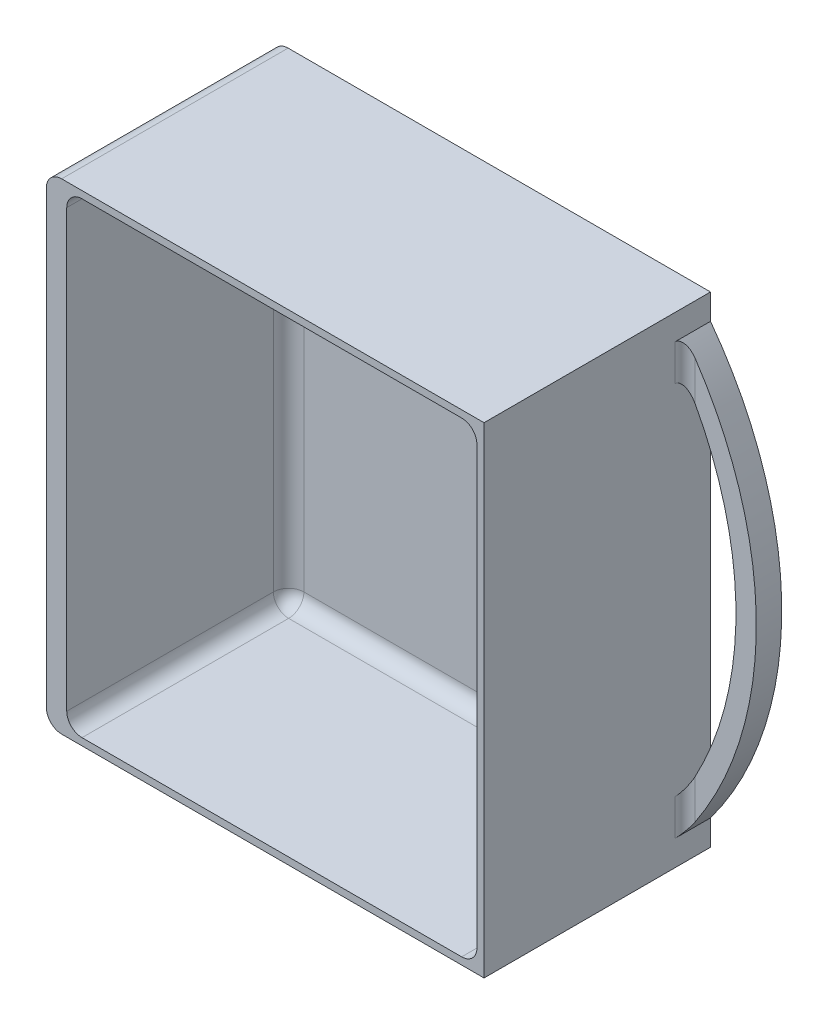
ISO-10303-21;
HEADER;
FILE_DESCRIPTION(('STEP AP214'),'2;1');
FILE_NAME('part.step','',(''),(''),'','','');
FILE_SCHEMA(('AUTOMOTIVE_DESIGN { 1 0 10303 214 1 1 1 1 }'));
ENDSEC;
DATA;
#1=APPLICATION_CONTEXT('core data for automotive mechanical design processes');
#2=APPLICATION_PROTOCOL_DEFINITION('international standard','automotive_design',2000,#1);
#3=PRODUCT_CONTEXT('',#1,'mechanical');
#4=PRODUCT('Part','Part','',(#3));
#5=PRODUCT_RELATED_PRODUCT_CATEGORY('part','',(#4));
#6=PRODUCT_DEFINITION_FORMATION('','',#4);
#7=PRODUCT_DEFINITION_CONTEXT('part definition',#1,'design');
#8=PRODUCT_DEFINITION('design','',#6,#7);
#9=PRODUCT_DEFINITION_SHAPE('','',#8);
#10=(LENGTH_UNIT() NAMED_UNIT(*) SI_UNIT(.MILLI.,.METRE.));
#11=(NAMED_UNIT(*) PLANE_ANGLE_UNIT() SI_UNIT($,.RADIAN.));
#12=(NAMED_UNIT(*) SI_UNIT($,.STERADIAN.) SOLID_ANGLE_UNIT());
#13=UNCERTAINTY_MEASURE_WITH_UNIT(LENGTH_MEASURE(1.E-05),#10,'distance_accuracy_value','');
#14=(GEOMETRIC_REPRESENTATION_CONTEXT(3) GLOBAL_UNCERTAINTY_ASSIGNED_CONTEXT((#13)) GLOBAL_UNIT_ASSIGNED_CONTEXT((#10,
#11,#12)) REPRESENTATION_CONTEXT('',''));
#15=CARTESIAN_POINT('',(0.,0.,0.));
#16=DIRECTION('',(0.,0.,1.));
#17=DIRECTION('',(1.,0.,0.));
#18=AXIS2_PLACEMENT_3D('',#15,#16,#17);
#19=CARTESIAN_POINT('',(85.6,42.85,-18.35));
#20=DIRECTION('',(1.,0.,0.));
#21=DIRECTION('',(0.,0.,-1.));
#22=AXIS2_PLACEMENT_3D('',#19,#20,#21);
#23=SPHERICAL_SURFACE('',#22,3.);
#24=CARTESIAN_POINT('',(85.6,42.85,-18.35));
#25=DIRECTION('',(0.,0.,-1.));
#26=DIRECTION('',(-1.,0.,0.));
#27=AXIS2_PLACEMENT_3D('',#24,#25,#26);
#28=CIRCLE('',#27,3.);
#29=CARTESIAN_POINT('',(85.6,45.85,-18.35));
#30=VERTEX_POINT('',#29);
#31=CARTESIAN_POINT('',(88.6,42.85,-18.35));
#32=VERTEX_POINT('',#31);
#33=EDGE_CURVE('E350',#30,#32,#28,.T.);
#34=ORIENTED_EDGE('',*,*,#33,.F.);
#35=CARTESIAN_POINT('',(85.6,42.85,-18.35));
#36=DIRECTION('',(1.,0.,0.));
#37=DIRECTION('',(0.,0.,-1.));
#38=AXIS2_PLACEMENT_3D('',#35,#36,#37);
#39=CIRCLE('',#38,3.);
#40=CARTESIAN_POINT('',(85.6,42.85,-21.35));
#41=VERTEX_POINT('',#40);
#42=EDGE_CURVE('E334',#41,#30,#39,.T.);
#43=ORIENTED_EDGE('',*,*,#42,.F.);
#44=CARTESIAN_POINT('',(85.6,42.85,-18.35));
#45=DIRECTION('',(0.,-1.,0.));
#46=DIRECTION('',(0.,0.,-1.));
#47=AXIS2_PLACEMENT_3D('',#44,#45,#46);
#48=CIRCLE('',#47,3.);
#49=EDGE_CURVE('E347',#41,#32,#48,.T.);
#50=ORIENTED_EDGE('',*,*,#49,.T.);
#51=EDGE_LOOP('',(#34,#43,#50));
#52=FACE_BOUND('',#51,.T.);
#53=ADVANCED_FACE('F33',(#52),#23,.F.);
#54=CARTESIAN_POINT('',(85.6,0.,-18.35));
#55=DIRECTION('',(0.,1.,0.));
#56=DIRECTION('',(0.,0.,1.));
#57=AXIS2_PLACEMENT_3D('',#54,#55,#56);
#58=CYLINDRICAL_SURFACE('',#57,3.);
#59=ORIENTED_EDGE('',*,*,#49,.F.);
#60=DIRECTION('',(0.,1.,0.));
#61=VECTOR('',#60,1.);
#62=CARTESIAN_POINT('',(85.6,0.,-21.35));
#63=LINE('',#62,#61);
#64=CARTESIAN_POINT('',(85.6,-42.85,-21.35));
#65=VERTEX_POINT('',#64);
#66=EDGE_CURVE('E331',#65,#41,#63,.T.);
#67=ORIENTED_EDGE('',*,*,#66,.F.);
#68=CARTESIAN_POINT('',(85.6,-42.85,-18.35));
#69=DIRECTION('',(0.,-1.,0.));
#70=DIRECTION('',(0.,0.,-1.));
#71=AXIS2_PLACEMENT_3D('',#68,#69,#70);
#72=CIRCLE('',#71,3.);
#73=CARTESIAN_POINT('',(88.6,-42.85,-18.35));
#74=VERTEX_POINT('',#73);
#75=EDGE_CURVE('E345',#65,#74,#72,.T.);
#76=ORIENTED_EDGE('',*,*,#75,.T.);
#77=DIRECTION('',(0.,1.,0.));
#78=VECTOR('',#77,1.);
#79=CARTESIAN_POINT('',(88.6,-45.85,-18.35));
#80=LINE('',#79,#78);
#81=EDGE_CURVE('E322',#32,#74,#80,.F.);
#82=ORIENTED_EDGE('',*,*,#81,.F.);
#83=EDGE_LOOP('',(#59,#67,#76,#82));
#84=FACE_BOUND('',#83,.T.);
#85=ADVANCED_FACE('F389',(#84),#58,.F.);
#86=CARTESIAN_POINT('',(85.6,-42.85,-18.35));
#87=DIRECTION('',(1.,0.,0.));
#88=DIRECTION('',(0.,0.,-1.));
#89=AXIS2_PLACEMENT_3D('',#86,#87,#88);
#90=SPHERICAL_SURFACE('',#89,3.);
#91=ORIENTED_EDGE('',*,*,#75,.F.);
#92=CARTESIAN_POINT('',(85.6,-42.85,-18.35));
#93=DIRECTION('',(-1.,0.,0.));
#94=DIRECTION('',(0.,0.,1.));
#95=AXIS2_PLACEMENT_3D('',#92,#93,#94);
#96=CIRCLE('',#95,3.);
#97=CARTESIAN_POINT('',(85.6,-45.85,-18.35));
#98=VERTEX_POINT('',#97);
#99=EDGE_CURVE('E328',#98,#65,#96,.F.);
#100=ORIENTED_EDGE('',*,*,#99,.F.);
#101=CARTESIAN_POINT('',(85.6,-42.85,-18.35));
#102=DIRECTION('',(0.,0.,1.));
#103=DIRECTION('',(1.,0.,0.));
#104=AXIS2_PLACEMENT_3D('',#101,#102,#103);
#105=CIRCLE('',#104,3.);
#106=EDGE_CURVE('E342',#98,#74,#105,.T.);
#107=ORIENTED_EDGE('',*,*,#106,.T.);
#108=EDGE_LOOP('',(#91,#100,#107));
#109=FACE_BOUND('',#108,.T.);
#110=ADVANCED_FACE('F393',(#109),#90,.F.);
#111=CARTESIAN_POINT('',(85.6,-42.85,-21.35));
#112=DIRECTION('',(0.,0.,1.));
#113=DIRECTION('',(1.,0.,0.));
#114=AXIS2_PLACEMENT_3D('',#111,#112,#113);
#115=CYLINDRICAL_SURFACE('',#114,3.);
#116=ORIENTED_EDGE('',*,*,#106,.F.);
#117=DIRECTION('',(0.,0.,-1.));
#118=VECTOR('',#117,1.);
#119=CARTESIAN_POINT('',(85.6,-45.85,-21.35));
#120=LINE('',#119,#118);
#121=CARTESIAN_POINT('',(85.6,-45.85,22.25));
#122=VERTEX_POINT('',#121);
#123=EDGE_CURVE('E316',#122,#98,#120,.T.);
#124=ORIENTED_EDGE('',*,*,#123,.F.);
#125=CARTESIAN_POINT('',(85.6,-42.85,22.25));
#126=DIRECTION('',(0.,0.,1.));
#127=DIRECTION('',(1.,0.,0.));
#128=AXIS2_PLACEMENT_3D('',#125,#126,#127);
#129=CIRCLE('',#128,3.);
#130=CARTESIAN_POINT('',(88.6,-42.85,22.25));
#131=VERTEX_POINT('',#130);
#132=EDGE_CURVE('E340',#122,#131,#129,.T.);
#133=ORIENTED_EDGE('',*,*,#132,.T.);
#134=DIRECTION('',(0.,0.,-1.));
#135=VECTOR('',#134,1.);
#136=CARTESIAN_POINT('',(88.6,-42.85,-21.35));
#137=LINE('',#136,#135);
#138=EDGE_CURVE('E325',#74,#131,#137,.F.);
#139=ORIENTED_EDGE('',*,*,#138,.F.);
#140=EDGE_LOOP('',(#116,#124,#133,#139));
#141=FACE_BOUND('',#140,.T.);
#142=ADVANCED_FACE('F385',(#141),#115,.F.);
#143=CARTESIAN_POINT('',(85.6,42.85,-21.35));
#144=DIRECTION('',(0.,0.,-1.));
#145=DIRECTION('',(-1.,0.,0.));
#146=AXIS2_PLACEMENT_3D('',#143,#144,#145);
#147=CYLINDRICAL_SURFACE('',#146,3.);
#148=DIRECTION('',(0.,0.,1.));
#149=VECTOR('',#148,1.);
#150=CARTESIAN_POINT('',(85.6,45.85,-21.35));
#151=LINE('',#150,#149);
#152=CARTESIAN_POINT('',(85.6,45.85,22.25));
#153=VERTEX_POINT('',#152);
#154=EDGE_CURVE('E337',#30,#153,#151,.T.);
#155=ORIENTED_EDGE('',*,*,#154,.F.);
#156=ORIENTED_EDGE('',*,*,#33,.T.);
#157=DIRECTION('',(0.,0.,1.));
#158=VECTOR('',#157,1.);
#159=CARTESIAN_POINT('',(88.6,42.85,-21.35));
#160=LINE('',#159,#158);
#161=CARTESIAN_POINT('',(88.6,42.85,22.25));
#162=VERTEX_POINT('',#161);
#163=EDGE_CURVE('E319',#162,#32,#160,.F.);
#164=ORIENTED_EDGE('',*,*,#163,.F.);
#165=CARTESIAN_POINT('',(85.6,42.85,22.25));
#166=DIRECTION('',(0.,0.,1.));
#167=DIRECTION('',(1.,0.,0.));
#168=AXIS2_PLACEMENT_3D('',#165,#166,#167);
#169=CIRCLE('',#168,3.);
#170=EDGE_CURVE('E352',#162,#153,#169,.T.);
#171=ORIENTED_EDGE('',*,*,#170,.T.);
#172=EDGE_LOOP('',(#155,#156,#164,#171));
#173=FACE_BOUND('',#172,.T.);
#174=ADVANCED_FACE('F380',(#173),#147,.F.);
#175=CARTESIAN_POINT('',(11.,42.85,-18.35));
#176=DIRECTION('',(0.,1.,0.));
#177=DIRECTION('',(0.,0.,1.));
#178=AXIS2_PLACEMENT_3D('',#175,#176,#177);
#179=SPHERICAL_SURFACE('',#178,3.);
#180=CARTESIAN_POINT('',(11.,42.85,-18.35));
#181=DIRECTION('',(-1.,0.,0.));
#182=DIRECTION('',(0.,0.,1.));
#183=AXIS2_PLACEMENT_3D('',#180,#181,#182);
#184=CIRCLE('',#183,3.);
#185=CARTESIAN_POINT('',(11.,45.85,-18.35));
#186=VERTEX_POINT('',#185);
#187=CARTESIAN_POINT('',(11.,42.85,-21.35));
#188=VERTEX_POINT('',#187);
#189=EDGE_CURVE('E313',#186,#188,#184,.T.);
#190=ORIENTED_EDGE('',*,*,#189,.F.);
#191=CARTESIAN_POINT('',(11.,42.85,-18.35));
#192=DIRECTION('',(0.,0.,1.));
#193=DIRECTION('',(1.,0.,0.));
#194=AXIS2_PLACEMENT_3D('',#191,#192,#193);
#195=CIRCLE('',#194,3.);
#196=CARTESIAN_POINT('',(8.00000000000001,42.85,-18.35));
#197=VERTEX_POINT('',#196);
#198=EDGE_CURVE('E311',#186,#197,#195,.T.);
#199=ORIENTED_EDGE('',*,*,#198,.T.);
#200=CARTESIAN_POINT('',(11.,42.85,-18.35));
#201=DIRECTION('',(0.,1.,0.));
#202=DIRECTION('',(-1.,0.,0.));
#203=AXIS2_PLACEMENT_3D('',#200,#201,#202);
#204=CIRCLE('',#203,3.);
#205=EDGE_CURVE('E304',#188,#197,#204,.T.);
#206=ORIENTED_EDGE('',*,*,#205,.F.);
#207=EDGE_LOOP('',(#190,#199,#206));
#208=FACE_BOUND('',#207,.T.);
#209=ADVANCED_FACE('F384',(#208),#179,.F.);
#210=CARTESIAN_POINT('',(11.,42.85,-21.35));
#211=DIRECTION('',(0.,0.,1.));
#212=DIRECTION('',(1.,0.,0.));
#213=AXIS2_PLACEMENT_3D('',#210,#211,#212);
#214=CYLINDRICAL_SURFACE('',#213,3.);
#215=ORIENTED_EDGE('',*,*,#198,.F.);
#216=DIRECTION('',(0.,0.,-1.));
#217=VECTOR('',#216,1.);
#218=CARTESIAN_POINT('',(11.,45.85,-21.35));
#219=LINE('',#218,#217);
#220=CARTESIAN_POINT('',(11.,45.85,22.25));
#221=VERTEX_POINT('',#220);
#222=EDGE_CURVE('E298',#221,#186,#219,.T.);
#223=ORIENTED_EDGE('',*,*,#222,.F.);
#224=CARTESIAN_POINT('',(11.,42.85,22.25));
#225=DIRECTION('',(0.,0.,1.));
#226=DIRECTION('',(1.,0.,0.));
#227=AXIS2_PLACEMENT_3D('',#224,#225,#226);
#228=CIRCLE('',#227,3.);
#229=CARTESIAN_POINT('',(8.00000000000001,42.85,22.25));
#230=VERTEX_POINT('',#229);
#231=EDGE_CURVE('E309',#221,#230,#228,.T.);
#232=ORIENTED_EDGE('',*,*,#231,.T.);
#233=DIRECTION('',(0.,0.,-1.));
#234=VECTOR('',#233,1.);
#235=CARTESIAN_POINT('',(8.00000000000001,42.85,-21.35));
#236=LINE('',#235,#234);
#237=EDGE_CURVE('E301',#197,#230,#236,.F.);
#238=ORIENTED_EDGE('',*,*,#237,.F.);
#239=EDGE_LOOP('',(#215,#223,#232,#238));
#240=FACE_BOUND('',#239,.T.);
#241=ADVANCED_FACE('F405',(#240),#214,.F.);
#242=CARTESIAN_POINT('',(88.6,42.85,-18.35));
#243=DIRECTION('',(1.,0.,0.));
#244=DIRECTION('',(0.,0.,-1.));
#245=AXIS2_PLACEMENT_3D('',#242,#243,#244);
#246=CYLINDRICAL_SURFACE('',#245,3.);
#247=DIRECTION('',(1.,0.,0.));
#248=VECTOR('',#247,1.);
#249=CARTESIAN_POINT('',(0.,42.85,-21.35));
#250=LINE('',#249,#248);
#251=EDGE_CURVE('E307',#41,#188,#250,.F.);
#252=ORIENTED_EDGE('',*,*,#251,.F.);
#253=ORIENTED_EDGE('',*,*,#42,.T.);
#254=DIRECTION('',(1.,0.,0.));
#255=VECTOR('',#254,1.);
#256=CARTESIAN_POINT('',(88.6,45.85,-18.35));
#257=LINE('',#256,#255);
#258=EDGE_CURVE('E295',#186,#30,#257,.T.);
#259=ORIENTED_EDGE('',*,*,#258,.F.);
#260=ORIENTED_EDGE('',*,*,#189,.T.);
#261=EDGE_LOOP('',(#252,#253,#259,#260));
#262=FACE_BOUND('',#261,.T.);
#263=ADVANCED_FACE('F401',(#262),#246,.F.);
#264=CARTESIAN_POINT('',(11.,-42.85,-18.35));
#265=DIRECTION('',(0.,-1.,0.));
#266=DIRECTION('',(0.,0.,-1.));
#267=AXIS2_PLACEMENT_3D('',#264,#265,#266);
#268=SPHERICAL_SURFACE('',#267,3.);
#269=CARTESIAN_POINT('',(11.,-42.85,-18.35));
#270=DIRECTION('',(0.,0.,-1.));
#271=DIRECTION('',(-1.,0.,0.));
#272=AXIS2_PLACEMENT_3D('',#269,#270,#271);
#273=CIRCLE('',#272,3.);
#274=CARTESIAN_POINT('',(11.,-45.85,-18.35));
#275=VERTEX_POINT('',#274);
#276=CARTESIAN_POINT('',(8.,-42.85,-18.35));
#277=VERTEX_POINT('',#276);
#278=EDGE_CURVE('E291',#275,#277,#273,.T.);
#279=ORIENTED_EDGE('',*,*,#278,.F.);
#280=CARTESIAN_POINT('',(11.,-42.85,-18.35));
#281=DIRECTION('',(1.,0.,0.));
#282=DIRECTION('',(0.,0.,-1.));
#283=AXIS2_PLACEMENT_3D('',#280,#281,#282);
#284=CIRCLE('',#283,3.);
#285=CARTESIAN_POINT('',(11.,-42.85,-21.35));
#286=VERTEX_POINT('',#285);
#287=EDGE_CURVE('E288',#275,#286,#284,.T.);
#288=ORIENTED_EDGE('',*,*,#287,.T.);
#289=CARTESIAN_POINT('',(11.,-42.85,-18.35));
#290=DIRECTION('',(0.,1.,0.));
#291=DIRECTION('',(-1.,0.,0.));
#292=AXIS2_PLACEMENT_3D('',#289,#290,#291);
#293=CIRCLE('',#292,3.);
#294=EDGE_CURVE('E282',#277,#286,#293,.F.);
#295=ORIENTED_EDGE('',*,*,#294,.F.);
#296=EDGE_LOOP('',(#279,#288,#295));
#297=FACE_BOUND('',#296,.T.);
#298=ADVANCED_FACE('F404',(#297),#268,.F.);
#299=CARTESIAN_POINT('',(8.,-42.85,-18.35));
#300=DIRECTION('',(-1.,0.,0.));
#301=DIRECTION('',(0.,0.,1.));
#302=AXIS2_PLACEMENT_3D('',#299,#300,#301);
#303=CYLINDRICAL_SURFACE('',#302,3.);
#304=DIRECTION('',(-1.,0.,0.));
#305=VECTOR('',#304,1.);
#306=CARTESIAN_POINT('',(8.,-45.85,-18.35));
#307=LINE('',#306,#305);
#308=EDGE_CURVE('E277',#98,#275,#307,.T.);
#309=ORIENTED_EDGE('',*,*,#308,.F.);
#310=ORIENTED_EDGE('',*,*,#99,.T.);
#311=DIRECTION('',(-1.,0.,0.));
#312=VECTOR('',#311,1.);
#313=CARTESIAN_POINT('',(0.,-42.85,-21.35));
#314=LINE('',#313,#312);
#315=EDGE_CURVE('E279',#286,#65,#314,.F.);
#316=ORIENTED_EDGE('',*,*,#315,.F.);
#317=ORIENTED_EDGE('',*,*,#287,.F.);
#318=EDGE_LOOP('',(#309,#310,#316,#317));
#319=FACE_BOUND('',#318,.T.);
#320=ADVANCED_FACE('F417',(#319),#303,.F.);
#321=CARTESIAN_POINT('',(11.,-42.85,-21.35));
#322=DIRECTION('',(0.,0.,-1.));
#323=DIRECTION('',(-1.,0.,0.));
#324=AXIS2_PLACEMENT_3D('',#321,#322,#323);
#325=CYLINDRICAL_SURFACE('',#324,3.);
#326=DIRECTION('',(0.,0.,1.));
#327=VECTOR('',#326,1.);
#328=CARTESIAN_POINT('',(11.,-45.85,-21.35));
#329=LINE('',#328,#327);
#330=CARTESIAN_POINT('',(11.,-45.85,22.25));
#331=VERTEX_POINT('',#330);
#332=EDGE_CURVE('E274',#275,#331,#329,.T.);
#333=ORIENTED_EDGE('',*,*,#332,.F.);
#334=ORIENTED_EDGE('',*,*,#278,.T.);
#335=DIRECTION('',(0.,0.,1.));
#336=VECTOR('',#335,1.);
#337=CARTESIAN_POINT('',(8.,-42.85,-21.35));
#338=LINE('',#337,#336);
#339=CARTESIAN_POINT('',(8.,-42.85,22.25));
#340=VERTEX_POINT('',#339);
#341=EDGE_CURVE('E285',#340,#277,#338,.F.);
#342=ORIENTED_EDGE('',*,*,#341,.F.);
#343=CARTESIAN_POINT('',(11.,-42.85,22.25));
#344=DIRECTION('',(0.,0.,1.));
#345=DIRECTION('',(1.,0.,0.));
#346=AXIS2_PLACEMENT_3D('',#343,#344,#345);
#347=CIRCLE('',#346,3.);
#348=EDGE_CURVE('E293',#340,#331,#347,.T.);
#349=ORIENTED_EDGE('',*,*,#348,.T.);
#350=EDGE_LOOP('',(#333,#334,#342,#349));
#351=FACE_BOUND('',#350,.T.);
#352=ADVANCED_FACE('F413',(#351),#325,.F.);
#353=CARTESIAN_POINT('',(11.,45.85,-18.35));
#354=DIRECTION('',(0.,1.,0.));
#355=DIRECTION('',(-1.,0.,0.));
#356=AXIS2_PLACEMENT_3D('',#353,#354,#355);
#357=CYLINDRICAL_SURFACE('',#356,3.);
#358=DIRECTION('',(0.,1.,0.));
#359=VECTOR('',#358,1.);
#360=CARTESIAN_POINT('',(11.,0.,-21.35));
#361=LINE('',#360,#359);
#362=EDGE_CURVE('E272',#188,#286,#361,.F.);
#363=ORIENTED_EDGE('',*,*,#362,.F.);
#364=ORIENTED_EDGE('',*,*,#205,.T.);
#365=DIRECTION('',(0.,1.,0.));
#366=VECTOR('',#365,1.);
#367=CARTESIAN_POINT('',(8.00000000000001,45.85,-18.35));
#368=LINE('',#367,#366);
#369=EDGE_CURVE('E269',#277,#197,#368,.T.);
#370=ORIENTED_EDGE('',*,*,#369,.F.);
#371=ORIENTED_EDGE('',*,*,#294,.T.);
#372=EDGE_LOOP('',(#363,#364,#370,#371));
#373=FACE_BOUND('',#372,.T.);
#374=ADVANCED_FACE('F416',(#373),#357,.F.);
#375=CARTESIAN_POINT('',(4.,-47.25,-17.25));
#376=DIRECTION('',(0.,-1.,0.));
#377=DIRECTION('',(1.,0.,0.));
#378=AXIS2_PLACEMENT_3D('',#375,#376,#377);
#379=PLANE('',#378);
#380=DIRECTION('',(1.,0.,0.));
#381=VECTOR('',#380,1.);
#382=CARTESIAN_POINT('',(4.,-47.25,22.25));
#383=LINE('',#382,#381);
#384=CARTESIAN_POINT('',(7.,-47.25,22.25));
#385=VERTEX_POINT('',#384);
#386=CARTESIAN_POINT('',(90.,-47.25,22.25));
#387=VERTEX_POINT('',#386);
#388=EDGE_CURVE('E235',#385,#387,#383,.T.);
#389=ORIENTED_EDGE('',*,*,#388,.F.);
#390=DIRECTION('',(0.,0.,1.));
#391=VECTOR('',#390,1.);
#392=CARTESIAN_POINT('',(7.,-47.25,-17.25));
#393=LINE('',#392,#391);
#394=CARTESIAN_POINT('',(7.,-47.25,-22.25));
#395=VERTEX_POINT('',#394);
#396=EDGE_CURVE('E260',#385,#395,#393,.F.);
#397=ORIENTED_EDGE('',*,*,#396,.T.);
#398=DIRECTION('',(-1.,0.,0.));
#399=VECTOR('',#398,1.);
#400=CARTESIAN_POINT('',(4.,-47.25,-22.25));
#401=LINE('',#400,#399);
#402=CARTESIAN_POINT('',(90.,-47.25,-22.25));
#403=VERTEX_POINT('',#402);
#404=EDGE_CURVE('E214',#403,#395,#401,.T.);
#405=ORIENTED_EDGE('',*,*,#404,.F.);
#406=DIRECTION('',(0.,0.,1.));
#407=VECTOR('',#406,1.);
#408=CARTESIAN_POINT('',(90.,-47.25,-17.25));
#409=LINE('',#408,#407);
#410=EDGE_CURVE('E246',#403,#387,#409,.T.);
#411=ORIENTED_EDGE('',*,*,#410,.T.);
#412=EDGE_LOOP('',(#389,#397,#405,#411));
#413=FACE_BOUND('',#412,.T.);
#414=ADVANCED_FACE('F427',(#413),#379,.T.);
#415=CARTESIAN_POINT('',(4.,47.25,-17.25));
#416=DIRECTION('',(-1.,0.,0.));
#417=DIRECTION('',(0.,0.,1.));
#418=AXIS2_PLACEMENT_3D('',#415,#416,#417);
#419=PLANE('',#418);
#420=DIRECTION('',(0.,1.,0.));
#421=VECTOR('',#420,1.);
#422=CARTESIAN_POINT('',(4.,47.25,-22.25));
#423=LINE('',#422,#421);
#424=CARTESIAN_POINT('',(4.,-44.25,-22.25));
#425=VERTEX_POINT('',#424);
#426=CARTESIAN_POINT('',(4.,44.25,-22.25));
#427=VERTEX_POINT('',#426);
#428=EDGE_CURVE('E217',#425,#427,#423,.T.);
#429=ORIENTED_EDGE('',*,*,#428,.F.);
#430=DIRECTION('',(0.,0.,1.));
#431=VECTOR('',#430,1.);
#432=CARTESIAN_POINT('',(4.,-44.25,-17.25));
#433=LINE('',#432,#431);
#434=CARTESIAN_POINT('',(4.,-44.25,22.25));
#435=VERTEX_POINT('',#434);
#436=EDGE_CURVE('E253',#425,#435,#433,.T.);
#437=ORIENTED_EDGE('',*,*,#436,.T.);
#438=DIRECTION('',(0.,-1.,0.));
#439=VECTOR('',#438,1.);
#440=CARTESIAN_POINT('',(4.,47.25,22.25));
#441=LINE('',#440,#439);
#442=CARTESIAN_POINT('',(4.,44.25,22.25));
#443=VERTEX_POINT('',#442);
#444=EDGE_CURVE('E243',#443,#435,#441,.T.);
#445=ORIENTED_EDGE('',*,*,#444,.F.);
#446=DIRECTION('',(0.,0.,1.));
#447=VECTOR('',#446,1.);
#448=CARTESIAN_POINT('',(4.,44.25,-17.25));
#449=LINE('',#448,#447);
#450=EDGE_CURVE('E249',#443,#427,#449,.F.);
#451=ORIENTED_EDGE('',*,*,#450,.T.);
#452=EDGE_LOOP('',(#429,#437,#445,#451));
#453=FACE_BOUND('',#452,.T.);
#454=ADVANCED_FACE('F439',(#453),#419,.T.);
#455=CARTESIAN_POINT('',(90.,47.25,-17.25));
#456=DIRECTION('',(0.,1.,0.));
#457=DIRECTION('',(-1.,0.,0.));
#458=AXIS2_PLACEMENT_3D('',#455,#456,#457);
#459=PLANE('',#458);
#460=DIRECTION('',(1.,0.,0.));
#461=VECTOR('',#460,1.);
#462=CARTESIAN_POINT('',(90.,47.25,-22.25));
#463=LINE('',#462,#461);
#464=CARTESIAN_POINT('',(6.99999999999999,47.25,-22.25));
#465=VERTEX_POINT('',#464);
#466=CARTESIAN_POINT('',(90.,47.25,-22.25));
#467=VERTEX_POINT('',#466);
#468=EDGE_CURVE('E220',#465,#467,#463,.T.);
#469=ORIENTED_EDGE('',*,*,#468,.F.);
#470=DIRECTION('',(0.,0.,1.));
#471=VECTOR('',#470,1.);
#472=CARTESIAN_POINT('',(6.99999999999999,47.25,-17.25));
#473=LINE('',#472,#471);
#474=CARTESIAN_POINT('',(6.99999999999999,47.25,22.25));
#475=VERTEX_POINT('',#474);
#476=EDGE_CURVE('E266',#465,#475,#473,.T.);
#477=ORIENTED_EDGE('',*,*,#476,.T.);
#478=DIRECTION('',(-1.,0.,0.));
#479=VECTOR('',#478,1.);
#480=CARTESIAN_POINT('',(90.,47.25,22.25));
#481=LINE('',#480,#479);
#482=CARTESIAN_POINT('',(90.,47.25,22.25));
#483=VERTEX_POINT('',#482);
#484=EDGE_CURVE('E240',#483,#475,#481,.T.);
#485=ORIENTED_EDGE('',*,*,#484,.F.);
#486=DIRECTION('',(0.,0.,1.));
#487=VECTOR('',#486,1.);
#488=CARTESIAN_POINT('',(90.,47.25,-17.25));
#489=LINE('',#488,#487);
#490=EDGE_CURVE('E247',#467,#483,#489,.T.);
#491=ORIENTED_EDGE('',*,*,#490,.F.);
#492=EDGE_LOOP('',(#469,#477,#485,#491));
#493=FACE_BOUND('',#492,.T.);
#494=ADVANCED_FACE('F444',(#493),#459,.T.);
#495=CARTESIAN_POINT('',(90.,-47.25,-17.25));
#496=DIRECTION('',(1.,0.,0.));
#497=DIRECTION('',(0.,0.,-1.));
#498=AXIS2_PLACEMENT_3D('',#495,#496,#497);
#499=PLANE('',#498);
#500=DIRECTION('',(0.,1.,0.));
#501=VECTOR('',#500,1.);
#502=CARTESIAN_POINT('',(90.,42.2500000000001,-15.25));
#503=LINE('',#502,#501);
#504=CARTESIAN_POINT('',(90.,35.1432019437208,-15.25));
#505=VERTEX_POINT('',#504);
#506=CARTESIAN_POINT('',(90.,42.2500000000001,-15.25));
#507=VERTEX_POINT('',#506);
#508=EDGE_CURVE('E356',#505,#507,#503,.T.);
#509=ORIENTED_EDGE('',*,*,#508,.T.);
#510=DIRECTION('',(0.,0.,1.));
#511=VECTOR('',#510,1.);
#512=CARTESIAN_POINT('',(90.,42.2500000000001,-22.25));
#513=LINE('',#512,#511);
#514=CARTESIAN_POINT('',(90.,42.2500000000001,-22.25));
#515=VERTEX_POINT('',#514);
#516=EDGE_CURVE('E233',#515,#507,#513,.T.);
#517=ORIENTED_EDGE('',*,*,#516,.F.);
#518=DIRECTION('',(0.,-1.,0.));
#519=VECTOR('',#518,1.);
#520=CARTESIAN_POINT('',(90.,42.25,-22.25));
#521=LINE('',#520,#519);
#522=EDGE_CURVE('E222',#467,#515,#521,.T.);
#523=ORIENTED_EDGE('',*,*,#522,.F.);
#524=ORIENTED_EDGE('',*,*,#490,.T.);
#525=DIRECTION('',(0.,1.,0.));
#526=VECTOR('',#525,1.);
#527=CARTESIAN_POINT('',(90.,-47.25,22.25));
#528=LINE('',#527,#526);
#529=EDGE_CURVE('E237',#387,#483,#528,.T.);
#530=ORIENTED_EDGE('',*,*,#529,.F.);
#531=ORIENTED_EDGE('',*,*,#410,.F.);
#532=DIRECTION('',(0.,-1.,0.));
#533=VECTOR('',#532,1.);
#534=CARTESIAN_POINT('',(90.,-47.25,-22.25));
#535=LINE('',#534,#533);
#536=CARTESIAN_POINT('',(90.,-42.25,-22.25));
#537=VERTEX_POINT('',#536);
#538=EDGE_CURVE('E226',#537,#403,#535,.T.);
#539=ORIENTED_EDGE('',*,*,#538,.F.);
#540=DIRECTION('',(0.,0.,1.));
#541=VECTOR('',#540,1.);
#542=CARTESIAN_POINT('',(90.,-42.25,-22.25));
#543=LINE('',#542,#541);
#544=CARTESIAN_POINT('',(90.,-42.25,-15.25));
#545=VERTEX_POINT('',#544);
#546=EDGE_CURVE('E229',#537,#545,#543,.T.);
#547=ORIENTED_EDGE('',*,*,#546,.T.);
#548=DIRECTION('',(0.,1.,0.));
#549=VECTOR('',#548,1.);
#550=CARTESIAN_POINT('',(90.,-35.1432019437208,-15.25));
#551=LINE('',#550,#549);
#552=CARTESIAN_POINT('',(90.,-35.1432019437208,-15.25));
#553=VERTEX_POINT('',#552);
#554=EDGE_CURVE('E354',#545,#553,#551,.T.);
#555=ORIENTED_EDGE('',*,*,#554,.T.);
#556=DIRECTION('',(0.,0.,1.));
#557=VECTOR('',#556,1.);
#558=CARTESIAN_POINT('',(90.,-35.1432019437208,-22.25));
#559=LINE('',#558,#557);
#560=CARTESIAN_POINT('',(90.,-35.1432019437208,-22.25));
#561=VERTEX_POINT('',#560);
#562=EDGE_CURVE('E193',#561,#553,#559,.T.);
#563=ORIENTED_EDGE('',*,*,#562,.F.);
#564=DIRECTION('',(0.,1.,0.));
#565=VECTOR('',#564,1.);
#566=CARTESIAN_POINT('',(90.,-35.1432019437208,-22.25));
#567=LINE('',#566,#565);
#568=CARTESIAN_POINT('',(90.,35.1432019437208,-22.25));
#569=VERTEX_POINT('',#568);
#570=EDGE_CURVE('E186',#561,#569,#567,.T.);
#571=ORIENTED_EDGE('',*,*,#570,.T.);
#572=DIRECTION('',(0.,0.,1.));
#573=VECTOR('',#572,1.);
#574=CARTESIAN_POINT('',(90.,35.1432019437208,-22.25));
#575=LINE('',#574,#573);
#576=EDGE_CURVE('E190',#569,#505,#575,.T.);
#577=ORIENTED_EDGE('',*,*,#576,.T.);
#578=EDGE_LOOP('',(#509,#517,#523,#524,#530,#531,#539,#547,#555,#563,#571,#577));
#579=FACE_BOUND('',#578,.T.);
#580=ADVANCED_FACE('F189',(#579),#499,.T.);
#581=CARTESIAN_POINT('',(0.,0.,22.25));
#582=DIRECTION('',(0.,0.,1.));
#583=DIRECTION('',(1.,0.,0.));
#584=AXIS2_PLACEMENT_3D('',#581,#582,#583);
#585=PLANE('',#584);
#586=DIRECTION('',(1.,0.,0.));
#587=VECTOR('',#586,1.);
#588=CARTESIAN_POINT('',(8.,-45.85,22.25));
#589=LINE('',#588,#587);
#590=EDGE_CURVE('E460',#331,#122,#589,.T.);
#591=ORIENTED_EDGE('',*,*,#590,.F.);
#592=ORIENTED_EDGE('',*,*,#348,.F.);
#593=DIRECTION('',(0.,-1.,0.));
#594=VECTOR('',#593,1.);
#595=CARTESIAN_POINT('',(8.00000000000001,45.85,22.25));
#596=LINE('',#595,#594);
#597=EDGE_CURVE('E207',#230,#340,#596,.T.);
#598=ORIENTED_EDGE('',*,*,#597,.F.);
#599=ORIENTED_EDGE('',*,*,#231,.F.);
#600=DIRECTION('',(-1.,0.,0.));
#601=VECTOR('',#600,1.);
#602=CARTESIAN_POINT('',(88.6,45.85,22.25));
#603=LINE('',#602,#601);
#604=EDGE_CURVE('E734',#153,#221,#603,.T.);
#605=ORIENTED_EDGE('',*,*,#604,.F.);
#606=ORIENTED_EDGE('',*,*,#170,.F.);
#607=DIRECTION('',(0.,1.,0.));
#608=VECTOR('',#607,1.);
#609=CARTESIAN_POINT('',(88.6,-45.85,22.25));
#610=LINE('',#609,#608);
#611=EDGE_CURVE('E743',#131,#162,#610,.T.);
#612=ORIENTED_EDGE('',*,*,#611,.F.);
#613=ORIENTED_EDGE('',*,*,#132,.F.);
#614=EDGE_LOOP('',(#591,#592,#598,#599,#605,#606,#612,#613));
#615=FACE_BOUND('',#614,.T.);
#616=ORIENTED_EDGE('',*,*,#444,.T.);
#617=CARTESIAN_POINT('',(7.,-44.25,22.25));
#618=DIRECTION('',(0.,0.,1.));
#619=DIRECTION('',(1.,0.,0.));
#620=AXIS2_PLACEMENT_3D('',#617,#618,#619);
#621=CIRCLE('',#620,3.);
#622=EDGE_CURVE('E258',#435,#385,#621,.T.);
#623=ORIENTED_EDGE('',*,*,#622,.T.);
#624=ORIENTED_EDGE('',*,*,#388,.T.);
#625=ORIENTED_EDGE('',*,*,#529,.T.);
#626=ORIENTED_EDGE('',*,*,#484,.T.);
#627=CARTESIAN_POINT('',(6.99999999999999,44.25,22.25));
#628=DIRECTION('',(0.,0.,1.));
#629=DIRECTION('',(1.,0.,0.));
#630=AXIS2_PLACEMENT_3D('',#627,#628,#629);
#631=CIRCLE('',#630,3.);
#632=EDGE_CURVE('E256',#475,#443,#631,.T.);
#633=ORIENTED_EDGE('',*,*,#632,.T.);
#634=EDGE_LOOP('',(#616,#623,#624,#625,#626,#633));
#635=FACE_BOUND('',#634,.T.);
#636=ADVANCED_FACE('F443',(#615,#635),#585,.T.);
#637=CARTESIAN_POINT('',(33.2477678571426,0.,-17.25));
#638=DIRECTION('',(0.,0.,1.));
#639=DIRECTION('',(1.,0.,0.));
#640=AXIS2_PLACEMENT_3D('',#637,#638,#639);
#641=PLANE('',#640);
#642=CARTESIAN_POINT('',(33.2477678571426,0.,-17.25));
#643=DIRECTION('',(0.,0.,-1.));
#644=DIRECTION('',(1.,0.,0.));
#645=AXIS2_PLACEMENT_3D('',#642,#643,#644);
#646=CIRCLE('',#645,70.7522321428574);
#647=CARTESIAN_POINT('',(92.,39.4214861646358,-17.25));
#648=VERTEX_POINT('',#647);
#649=CARTESIAN_POINT('',(92.,-39.4214861646358,-17.25));
#650=VERTEX_POINT('',#649);
#651=EDGE_CURVE('E213',#648,#650,#646,.T.);
#652=ORIENTED_EDGE('',*,*,#651,.F.);
#653=DIRECTION('',(0.,1.,0.));
#654=VECTOR('',#653,1.);
#655=CARTESIAN_POINT('',(92.,35.1432019437208,-17.25));
#656=LINE('',#655,#654);
#657=CARTESIAN_POINT('',(92.,31.6865225969294,-17.25));
#658=VERTEX_POINT('',#657);
#659=EDGE_CURVE('E59',#648,#658,#656,.F.);
#660=ORIENTED_EDGE('',*,*,#659,.T.);
#661=CARTESIAN_POINT('',(33.2477678571426,0.,-17.25));
#662=DIRECTION('',(0.,0.,-1.));
#663=DIRECTION('',(-1.,0.,0.));
#664=AXIS2_PLACEMENT_3D('',#661,#662,#663);
#665=CIRCLE('',#664,66.7522321428574);
#666=CARTESIAN_POINT('',(92.,-31.6865225969294,-17.25));
#667=VERTEX_POINT('',#666);
#668=EDGE_CURVE('E205',#658,#667,#665,.T.);
#669=ORIENTED_EDGE('',*,*,#668,.T.);
#670=DIRECTION('',(0.,1.,0.));
#671=VECTOR('',#670,1.);
#672=CARTESIAN_POINT('',(92.,-42.25,-17.25));
#673=LINE('',#672,#671);
#674=EDGE_CURVE('E358',#667,#650,#673,.F.);
#675=ORIENTED_EDGE('',*,*,#674,.T.);
#676=EDGE_LOOP('',(#652,#660,#669,#675));
#677=FACE_BOUND('',#676,.T.);
#678=ADVANCED_FACE('F451',(#677),#641,.T.);
#679=CARTESIAN_POINT('',(33.2477678571426,0.,-22.25));
#680=DIRECTION('',(0.,0.,1.));
#681=DIRECTION('',(1.,0.,0.));
#682=AXIS2_PLACEMENT_3D('',#679,#680,#681);
#683=PLANE('',#682);
#684=ORIENTED_EDGE('',*,*,#404,.T.);
#685=CARTESIAN_POINT('',(7.,-44.25,-22.25));
#686=DIRECTION('',(0.,0.,1.));
#687=DIRECTION('',(1.,0.,0.));
#688=AXIS2_PLACEMENT_3D('',#685,#686,#687);
#689=CIRCLE('',#688,3.);
#690=EDGE_CURVE('E264',#395,#425,#689,.F.);
#691=ORIENTED_EDGE('',*,*,#690,.T.);
#692=ORIENTED_EDGE('',*,*,#428,.T.);
#693=CARTESIAN_POINT('',(6.99999999999999,44.25,-22.25));
#694=DIRECTION('',(0.,0.,1.));
#695=DIRECTION('',(1.,0.,0.));
#696=AXIS2_PLACEMENT_3D('',#693,#694,#695);
#697=CIRCLE('',#696,3.);
#698=EDGE_CURVE('E262',#427,#465,#697,.F.);
#699=ORIENTED_EDGE('',*,*,#698,.T.);
#700=ORIENTED_EDGE('',*,*,#468,.T.);
#701=ORIENTED_EDGE('',*,*,#522,.T.);
#702=CARTESIAN_POINT('',(33.2477678571426,0.,-22.25));
#703=DIRECTION('',(0.,0.,-1.));
#704=DIRECTION('',(1.,0.,0.));
#705=AXIS2_PLACEMENT_3D('',#702,#703,#704);
#706=CIRCLE('',#705,70.7522321428574);
#707=EDGE_CURVE('E224',#515,#537,#706,.T.);
#708=ORIENTED_EDGE('',*,*,#707,.T.);
#709=ORIENTED_EDGE('',*,*,#538,.T.);
#710=EDGE_LOOP('',(#684,#691,#692,#699,#700,#701,#708,#709));
#711=FACE_BOUND('',#710,.T.);
#712=CARTESIAN_POINT('',(33.2477678571426,0.,-22.25));
#713=DIRECTION('',(0.,0.,-1.));
#714=DIRECTION('',(-1.,0.,0.));
#715=AXIS2_PLACEMENT_3D('',#712,#713,#714);
#716=CIRCLE('',#715,66.7522321428574);
#717=EDGE_CURVE('E197',#569,#561,#716,.T.);
#718=ORIENTED_EDGE('',*,*,#717,.F.);
#719=ORIENTED_EDGE('',*,*,#570,.F.);
#720=EDGE_LOOP('',(#718,#719));
#721=FACE_BOUND('',#720,.T.);
#722=ADVANCED_FACE('F204',(#711,#721),#683,.F.);
#723=CARTESIAN_POINT('',(33.2477678571426,0.,-22.25));
#724=DIRECTION('',(0.,0.,1.));
#725=DIRECTION('',(1.,0.,0.));
#726=AXIS2_PLACEMENT_3D('',#723,#724,#725);
#727=CYLINDRICAL_SURFACE('',#726,70.7522321428574);
#728=ORIENTED_EDGE('',*,*,#516,.T.);
#729=CARTESIAN_POINT('',(90.,42.2500000000001,-15.25));
#730=CARTESIAN_POINT('',(89.9999874788834,42.2500161962593,-15.290840128105));
#731=CARTESIAN_POINT('',(90.001250464362,42.2483203056222,-15.3316682058334));
#732=CARTESIAN_POINT('',(90.0062303948612,42.2416301158068,-15.412853666465));
#733=CARTESIAN_POINT('',(90.009944335067,42.2366398554483,-15.453211564222));
#734=CARTESIAN_POINT('',(90.0196727032517,42.2235625525865,-15.5326477526075));
#735=CARTESIAN_POINT('',(90.025659898701,42.2155121676762,-15.5717354628826));
#736=CARTESIAN_POINT('',(90.0397723134812,42.1965250204662,-15.6488034495113));
#737=CARTESIAN_POINT('',(90.047898040195,42.1855875731869,-15.6867834606762));
#738=CARTESIAN_POINT('',(90.0751156031064,42.1489243320777,-15.7983085331128));
#739=CARTESIAN_POINT('',(90.097107041732,42.1192682432516,-15.8698943765083));
#740=CARTESIAN_POINT('',(90.1472463161809,42.051509925224,-16.0067386528924));
#741=CARTESIAN_POINT('',(90.1754136022039,42.0133810064718,-16.0719761334156));
#742=CARTESIAN_POINT('',(90.2527974788015,41.9083659935058,-16.2290517132541));
#743=CARTESIAN_POINT('',(90.3051910619199,41.837037677716,-16.3163434134528));
#744=CARTESIAN_POINT('',(90.4169541606133,41.6841877278443,-16.4761810051449));
#745=CARTESIAN_POINT('',(90.4763375351832,41.6026458215468,-16.5486967954392));
#746=CARTESIAN_POINT('',(90.5878646322001,41.4487506640821,-16.6681741912575));
#747=CARTESIAN_POINT('',(90.6392634113137,41.3775621395179,-16.7173761593322));
#748=CARTESIAN_POINT('',(90.7440883508239,41.2317783526101,-16.8080414986375));
#749=CARTESIAN_POINT('',(90.7975157917436,41.1571809322641,-16.8494998808964));
#750=CARTESIAN_POINT('',(90.905902792362,41.0052018081247,-16.9255136824432));
#751=CARTESIAN_POINT('',(90.9608669874671,40.927811414697,-16.9600448824846));
#752=CARTESIAN_POINT('',(91.0716953101998,40.771080261146,-17.0226536240322));
#753=CARTESIAN_POINT('',(91.127559656795,40.6917390239217,-17.0507295691006));
#754=CARTESIAN_POINT('',(91.251686685654,40.5146612652354,-17.1062264161727));
#755=CARTESIAN_POINT('',(91.3200761518881,40.4165785630681,-17.1322567552708));
#756=CARTESIAN_POINT('',(91.4572034223519,40.2188321302914,-17.1762803338514));
#757=CARTESIAN_POINT('',(91.5259413514489,40.1191678009691,-17.1942704508089));
#758=CARTESIAN_POINT('',(91.6624524958253,39.9201367730558,-17.2225262250612));
#759=CARTESIAN_POINT('',(91.7302260532437,39.82078463139,-17.2328941180197));
#760=CARTESIAN_POINT('',(91.8654227760072,39.6215021001955,-17.2466159255821));
#761=CARTESIAN_POINT('',(91.9328462244736,39.5215723900871,-17.2499768601764));
#762=CARTESIAN_POINT('',(92.,39.4214861646358,-17.25));
#763=B_SPLINE_CURVE_WITH_KNOTS('',3,(#729,#730,#731,#732,#733,#734,#735,#736,#737,#738,#739,
#740,#741,#742,#743,#744,#745,#746,#747,#748,#749,#750,#751,#752,#753,#754,#755,#756,#757,#758,
#759,#760,#761,#762),.UNSPECIFIED.,.F.,.F.,(4,2,2,2,2,2,2,2,2,2,2,2,2,2,2,2,4),(0.,
0.12244625470134,0.244742671260656,0.365618034763671,0.486522102765734,0.726951392910683,
0.968149054463039,1.33897225964094,1.71054350794268,2.01208356427313,2.31381722916103,
2.61658812124228,2.91943381071105,3.28623755557842,3.65318362993899,4.01511334377608,
4.37668028016359),.UNSPECIFIED.);
#764=EDGE_CURVE('E361',#507,#648,#763,.T.);
#765=ORIENTED_EDGE('',*,*,#764,.T.);
#766=ORIENTED_EDGE('',*,*,#651,.T.);
#767=CARTESIAN_POINT('',(92.,-39.4214861646358,-17.25));
#768=CARTESIAN_POINT('',(91.9529400991034,-39.491622649196,-17.2499951952113));
#769=CARTESIAN_POINT('',(91.905759235272,-39.5616673284544,-17.2483393529307));
#770=CARTESIAN_POINT('',(91.8112133325598,-39.701490284508,-17.2416350172169));
#771=CARTESIAN_POINT('',(91.76384825685,-39.7712685018505,-17.236585806594));
#772=CARTESIAN_POINT('',(91.6211591101252,-39.9806719896679,-17.2161510375574));
#773=CARTESIAN_POINT('',(91.5256733821105,-40.1197219049607,-17.1954765866391));
#774=CARTESIAN_POINT('',(91.3342461386559,-40.396385782522,-17.1386096929906));
#775=CARTESIAN_POINT('',(91.2383093339675,-40.533972297469,-17.102267084613));
#776=CARTESIAN_POINT('',(91.048327943584,-40.8044209255026,-17.01220219745));
#777=CARTESIAN_POINT('',(90.9542794980923,-40.937293219755,-16.9585202680982));
#778=CARTESIAN_POINT('',(90.8275558294785,-41.1150818414645,-16.870844224137));
#779=CARTESIAN_POINT('',(90.793216425524,-41.1631280246602,-16.8454779286018));
#780=CARTESIAN_POINT('',(90.7252375559202,-41.2579960036753,-16.7917070130499));
#781=CARTESIAN_POINT('',(90.6915980780447,-41.3048178208852,-16.7633024461581));
#782=CARTESIAN_POINT('',(90.5919987606157,-41.4430982356486,-16.6732202761664));
#783=CARTESIAN_POINT('',(90.5273287779951,-41.5324128137955,-16.6066545088023));
#784=CARTESIAN_POINT('',(90.4028278042874,-41.7035827730543,-16.4577291719518));
#785=CARTESIAN_POINT('',(90.3430718655489,-41.7853242662189,-16.3751729166508));
#786=CARTESIAN_POINT('',(90.2330984337002,-41.935176365084,-16.1930124793154));
#787=CARTESIAN_POINT('',(90.1828455435102,-42.0033376076619,-16.0934742984872));
#788=CARTESIAN_POINT('',(90.1153515906085,-42.0946321303013,-15.9227839727581));
#789=CARTESIAN_POINT('',(90.0931132349747,-42.1246494382108,-15.85728660173));
#790=CARTESIAN_POINT('',(90.0550454272464,-42.1759716145004,-15.7212857964915));
#791=CARTESIAN_POINT('',(90.0391997190555,-42.1972985832668,-15.6507956028418));
#792=CARTESIAN_POINT('',(90.0182933210932,-42.2254192065555,-15.5252315211743));
#793=CARTESIAN_POINT('',(90.0114935815801,-42.2345580926646,-15.4709667617378));
#794=CARTESIAN_POINT('',(90.0023187708242,-42.246885322535,-15.3611603718385));
#795=CARTESIAN_POINT('',(89.9999634019172,-42.2500471696018,-15.3056141555296));
#796=CARTESIAN_POINT('',(90.,-42.25,-15.25));
#797=B_SPLINE_CURVE_WITH_KNOTS('',3,(#767,#768,#769,#770,#771,#772,#773,#774,#775,#776,#777,
#778,#779,#780,#781,#782,#783,#784,#785,#786,#787,#788,#789,#790,#791,#792,#793,#794,#795,#796),
.UNSPECIFIED.,.F.,.F.,(4,2,2,2,2,2,2,2,2,2,2,2,2,2,4),(0.,0.25334888142396,0.506751325073363,
1.01587665858775,1.5299939437211,2.04292336985207,2.23567036013459,2.42841398074203,
2.81373977136126,3.20414653838548,3.59306916394754,3.81851496857554,4.04338380941216,
4.20923818509775,4.37582609789767),.UNSPECIFIED.);
#798=EDGE_CURVE('E11',#650,#545,#797,.T.);
#799=ORIENTED_EDGE('',*,*,#798,.T.);
#800=ORIENTED_EDGE('',*,*,#546,.F.);
#801=ORIENTED_EDGE('',*,*,#707,.F.);
#802=EDGE_LOOP('',(#728,#765,#766,#799,#800,#801));
#803=FACE_BOUND('',#802,.T.);
#804=ADVANCED_FACE('F370',(#803),#727,.T.);
#805=CARTESIAN_POINT('',(33.2477678571426,0.,-22.25));
#806=DIRECTION('',(0.,0.,1.));
#807=DIRECTION('',(1.,0.,0.));
#808=AXIS2_PLACEMENT_3D('',#805,#806,#807);
#809=CYLINDRICAL_SURFACE('',#808,66.7522321428574);
#810=ORIENTED_EDGE('',*,*,#668,.F.);
#811=CARTESIAN_POINT('',(92.,31.6865225969294,-17.25));
#812=CARTESIAN_POINT('',(91.9512605273061,31.7768947733669,-17.2499923390286));
#813=CARTESIAN_POINT('',(91.90231014429,31.8671572025311,-17.2482179575906));
#814=CARTESIAN_POINT('',(91.8040446242803,32.0473629070156,-17.240989041573));
#815=CARTESIAN_POINT('',(91.7547294016645,32.137306099582,-17.2355336141423));
#816=CARTESIAN_POINT('',(91.6555239775367,32.3172575703841,-17.2207523963833));
#817=CARTESIAN_POINT('',(91.6056321002143,32.407263117525,-17.2114040213519));
#818=CARTESIAN_POINT('',(91.5056653667335,32.586629634483,-17.1886226206509));
#819=CARTESIAN_POINT('',(91.4555905248501,32.6759906530341,-17.1751899071921));
#820=CARTESIAN_POINT('',(91.3041093330868,32.9448664752277,-17.1280417914149));
#821=CARTESIAN_POINT('',(91.2025238583276,33.1232198124179,-17.0876248266573));
#822=CARTESIAN_POINT('',(91.0510467731459,33.3864000754512,-17.0114353812375));
#823=CARTESIAN_POINT('',(91.000758039278,33.4733110061928,-16.9834831793963));
#824=CARTESIAN_POINT('',(90.9006966763503,33.6453588531702,-16.9218226343703));
#825=CARTESIAN_POINT('',(90.8509238501253,33.7304964606989,-16.8881165831756));
#826=CARTESIAN_POINT('',(90.7732355977849,33.8627257523897,-16.8299686115671));
#827=CARTESIAN_POINT('',(90.7450272660235,33.9105984458632,-16.807683536252));
#828=CARTESIAN_POINT('',(90.6889892804884,34.0054350675632,-16.7608224385773));
#829=CARTESIAN_POINT('',(90.6611596407683,34.0523989620904,-16.7362463314598));
#830=CARTESIAN_POINT('',(90.5784070047849,34.19166471605,-16.6588262028765));
#831=CARTESIAN_POINT('',(90.5241925146361,34.2823878942091,-16.6022700706164));
#832=CARTESIAN_POINT('',(90.4184857056304,34.4583828116451,-16.4770291166922));
#833=CARTESIAN_POINT('',(90.3670215631544,34.5435995087479,-16.4082418729169));
#834=CARTESIAN_POINT('',(90.2695227700883,34.7043039686604,-16.2567445179968));
#835=CARTESIAN_POINT('',(90.2234754146748,34.7798145369703,-16.1740681367574));
#836=CARTESIAN_POINT('',(90.1570171945787,34.8883957862035,-16.0290938883069));
#837=CARTESIAN_POINT('',(90.1337076521374,34.9263794309148,-15.9718250918832));
#838=CARTESIAN_POINT('',(90.0915202161946,34.9949986075111,-15.8514645109306));
#839=CARTESIAN_POINT('',(90.0726392312453,35.0256392656492,-15.7883768315148));
#840=CARTESIAN_POINT('',(90.0426675875663,35.0742153015376,-15.6651582252606));
#841=CARTESIAN_POINT('',(90.0309007291898,35.0932558465628,-15.6056327965158));
#842=CARTESIAN_POINT('',(90.0127541613359,35.1226014507921,-15.483717271271));
#843=CARTESIAN_POINT('',(90.006361437688,35.1329276132499,-15.4213344831929));
#844=CARTESIAN_POINT('',(90.0019629797612,35.1400317689783,-15.3404333427513));
#845=CARTESIAN_POINT('',(90.001227466445,35.1412196509755,-15.3223705076018));
#846=CARTESIAN_POINT('',(90.0002464524249,35.142803971234,-15.2862074860866));
#847=CARTESIAN_POINT('',(90.0000006651822,35.1432008722982,-15.2681073277687));
#848=CARTESIAN_POINT('',(90.,35.1432019437208,-15.25));
#849=B_SPLINE_CURVE_WITH_KNOTS('',3,(#811,#812,#813,#814,#815,#816,#817,#818,#819,#820,#821,
#822,#823,#824,#825,#826,#827,#828,#829,#830,#831,#832,#833,#834,#835,#836,#837,#838,#839,#840,
#841,#842,#843,#844,#845,#846,#847,#848),.UNSPECIFIED.,.F.,.F.,(4,2,2,2,2,2,2,2,2,2,2,2,2,2,2,2,
2,2,4),(0.,0.308021266695068,0.616117271957112,0.926026143466282,1.23591133118218,
1.86237343790092,2.17493493061802,2.48737220679349,2.66692787528122,2.84649018916204,
3.20544004758133,3.56755090078345,3.92879475071656,4.14591866332407,4.36289055389079,
4.55292206388665,4.74249205113383,4.79682559393085,4.8511273368176),.UNSPECIFIED.);
#850=EDGE_CURVE('E201',#658,#505,#849,.T.);
#851=ORIENTED_EDGE('',*,*,#850,.T.);
#852=ORIENTED_EDGE('',*,*,#576,.F.);
#853=ORIENTED_EDGE('',*,*,#717,.T.);
#854=ORIENTED_EDGE('',*,*,#562,.T.);
#855=CARTESIAN_POINT('',(90.,-35.1432019437208,-15.25));
#856=CARTESIAN_POINT('',(89.9999958020247,-35.1432084341785,-15.2816248656444));
#857=CARTESIAN_POINT('',(90.000750627401,-35.1419897904818,-15.3132332675421));
#858=CARTESIAN_POINT('',(90.0037359996213,-35.1371681933313,-15.3761681401921));
#859=CARTESIAN_POINT('',(90.005965147127,-35.1335675007747,-15.4074948497597));
#860=CARTESIAN_POINT('',(90.0147419711768,-35.1193860083453,-15.500126621899));
#861=CARTESIAN_POINT('',(90.0233809665129,-35.1054227572317,-15.5607457972023));
#862=CARTESIAN_POINT('',(90.0479448862407,-35.0656674080742,-15.6913796109117));
#863=CARTESIAN_POINT('',(90.0650442828889,-35.0379655950087,-15.7605774810047));
#864=CARTESIAN_POINT('',(90.1048843517205,-34.9732790620618,-15.8929187343076));
#865=CARTESIAN_POINT('',(90.127647322075,-34.9362576428199,-15.9560367844094));
#866=CARTESIAN_POINT('',(90.1896289394543,-34.8351826810404,-16.1055628088073));
#867=CARTESIAN_POINT('',(90.231405993791,-34.7668346904243,-16.1879717505819));
#868=CARTESIAN_POINT('',(90.3206064398205,-34.6202109502603,-16.3396825134325));
#869=CARTESIAN_POINT('',(90.3680395740246,-34.5419180551871,-16.4089611705756));
#870=CARTESIAN_POINT('',(90.4605985392363,-34.3883641134207,-16.528774909441));
#871=CARTESIAN_POINT('',(90.5053414840763,-34.3138262269653,-16.5805556369516));
#872=CARTESIAN_POINT('',(90.5966420699471,-34.161016582568,-16.6765262784867));
#873=CARTESIAN_POINT('',(90.6432011066706,-34.0827419421067,-16.7207102074093));
#874=CARTESIAN_POINT('',(90.7377241201251,-33.9230612002864,-16.8026070800783));
#875=CARTESIAN_POINT('',(90.785694218099,-33.8416407440805,-16.8402846165014));
#876=CARTESIAN_POINT('',(90.8823537323759,-33.6767597806263,-16.9096384043777));
#877=CARTESIAN_POINT('',(90.9310429541677,-33.5932998211728,-16.9413162477277));
#878=CARTESIAN_POINT('',(91.0657273599278,-33.3612529615343,-17.0211869364778));
#879=CARTESIAN_POINT('',(91.1521731249346,-33.21100448822,-17.0638248850283));
#880=CARTESIAN_POINT('',(91.3253395820452,-32.9072456191212,-17.1350982581764));
#881=CARTESIAN_POINT('',(91.4120604792463,-32.753731539634,-17.1637168875881));
#882=CARTESIAN_POINT('',(91.5829678323688,-32.4483407204673,-17.2079799793248));
#883=CARTESIAN_POINT('',(91.667165378814,-32.2965123486283,-17.2239177928142));
#884=CARTESIAN_POINT('',(91.7926753966606,-32.0680811938488,-17.2396695666511));
#885=CARTESIAN_POINT('',(91.8343288634647,-31.9919194108668,-17.2435612091923));
#886=CARTESIAN_POINT('',(91.917370621036,-31.8393741848933,-17.2487247092501));
#887=CARTESIAN_POINT('',(91.9587589429447,-31.762990769523,-17.2499968802686));
#888=CARTESIAN_POINT('',(92.,-31.6865225969294,-17.25));
#889=B_SPLINE_CURVE_WITH_KNOTS('',3,(#855,#856,#857,#858,#859,#860,#861,#862,#863,#864,#865,
#866,#867,#868,#869,#870,#871,#872,#873,#874,#875,#876,#877,#878,#879,#880,#881,#882,#883,#884,
#885,#886,#887,#888),.UNSPECIFIED.,.F.,.F.,(4,2,2,2,2,2,2,2,2,2,2,2,2,2,2,2,4),(0.,
0.0948114916246395,0.189533122759115,0.377017100425885,0.605197153001965,0.83429020184072,
1.17714602118126,1.52060117515109,1.82373453620086,2.12710563586826,2.4320789173202,
2.73697116659492,3.27173117389196,3.80713026799836,4.32975104478302,4.59040333221005,
4.85102442261596),.UNSPECIFIED.);
#890=EDGE_CURVE('E46',#553,#667,#889,.T.);
#891=ORIENTED_EDGE('',*,*,#890,.T.);
#892=EDGE_LOOP('',(#810,#851,#852,#853,#854,#891));
#893=FACE_BOUND('',#892,.T.);
#894=ADVANCED_FACE('F199',(#893),#809,.F.);
#895=CARTESIAN_POINT('',(8.,-45.85,-21.35));
#896=DIRECTION('',(0.,-1.,0.));
#897=DIRECTION('',(0.,0.,-1.));
#898=AXIS2_PLACEMENT_3D('',#895,#896,#897);
#899=PLANE('',#898);
#900=ORIENTED_EDGE('',*,*,#590,.T.);
#901=ORIENTED_EDGE('',*,*,#123,.T.);
#902=ORIENTED_EDGE('',*,*,#308,.T.);
#903=ORIENTED_EDGE('',*,*,#332,.T.);
#904=EDGE_LOOP('',(#900,#901,#902,#903));
#905=FACE_BOUND('',#904,.T.);
#906=ADVANCED_FACE('F493',(#905),#899,.F.);
#907=CARTESIAN_POINT('',(8.00000000000001,45.85,-21.35));
#908=DIRECTION('',(-1.,0.,0.));
#909=DIRECTION('',(0.,-1.,0.));
#910=AXIS2_PLACEMENT_3D('',#907,#908,#909);
#911=PLANE('',#910);
#912=ORIENTED_EDGE('',*,*,#369,.T.);
#913=ORIENTED_EDGE('',*,*,#237,.T.);
#914=ORIENTED_EDGE('',*,*,#597,.T.);
#915=ORIENTED_EDGE('',*,*,#341,.T.);
#916=EDGE_LOOP('',(#912,#913,#914,#915));
#917=FACE_BOUND('',#916,.T.);
#918=ADVANCED_FACE('F514',(#917),#911,.F.);
#919=CARTESIAN_POINT('',(88.6,45.85,-21.35));
#920=DIRECTION('',(0.,1.,0.));
#921=DIRECTION('',(0.,0.,1.));
#922=AXIS2_PLACEMENT_3D('',#919,#920,#921);
#923=PLANE('',#922);
#924=ORIENTED_EDGE('',*,*,#258,.T.);
#925=ORIENTED_EDGE('',*,*,#154,.T.);
#926=ORIENTED_EDGE('',*,*,#604,.T.);
#927=ORIENTED_EDGE('',*,*,#222,.T.);
#928=EDGE_LOOP('',(#924,#925,#926,#927));
#929=FACE_BOUND('',#928,.T.);
#930=ADVANCED_FACE('F522',(#929),#923,.F.);
#931=CARTESIAN_POINT('',(88.6,-45.85,-21.35));
#932=DIRECTION('',(1.,0.,0.));
#933=DIRECTION('',(0.,0.,-1.));
#934=AXIS2_PLACEMENT_3D('',#931,#932,#933);
#935=PLANE('',#934);
#936=ORIENTED_EDGE('',*,*,#81,.T.);
#937=ORIENTED_EDGE('',*,*,#138,.T.);
#938=ORIENTED_EDGE('',*,*,#611,.T.);
#939=ORIENTED_EDGE('',*,*,#163,.T.);
#940=EDGE_LOOP('',(#936,#937,#938,#939));
#941=FACE_BOUND('',#940,.T.);
#942=ADVANCED_FACE('F531',(#941),#935,.F.);
#943=CARTESIAN_POINT('',(0.,0.,-21.35));
#944=DIRECTION('',(0.,0.,1.));
#945=DIRECTION('',(1.,0.,0.));
#946=AXIS2_PLACEMENT_3D('',#943,#944,#945);
#947=PLANE('',#946);
#948=ORIENTED_EDGE('',*,*,#315,.T.);
#949=ORIENTED_EDGE('',*,*,#66,.T.);
#950=ORIENTED_EDGE('',*,*,#251,.T.);
#951=ORIENTED_EDGE('',*,*,#362,.T.);
#952=EDGE_LOOP('',(#948,#949,#950,#951));
#953=FACE_BOUND('',#952,.T.);
#954=ADVANCED_FACE('F435',(#953),#947,.T.);
#955=CARTESIAN_POINT('',(7.,-44.25,-17.25));
#956=DIRECTION('',(0.,0.,1.));
#957=DIRECTION('',(1.,0.,0.));
#958=AXIS2_PLACEMENT_3D('',#955,#956,#957);
#959=CYLINDRICAL_SURFACE('',#958,3.);
#960=ORIENTED_EDGE('',*,*,#690,.F.);
#961=ORIENTED_EDGE('',*,*,#396,.F.);
#962=ORIENTED_EDGE('',*,*,#622,.F.);
#963=ORIENTED_EDGE('',*,*,#436,.F.);
#964=EDGE_LOOP('',(#960,#961,#962,#963));
#965=FACE_BOUND('',#964,.T.);
#966=ADVANCED_FACE('F431',(#965),#959,.T.);
#967=CARTESIAN_POINT('',(6.99999999999999,44.25,-17.25));
#968=DIRECTION('',(0.,0.,1.));
#969=DIRECTION('',(1.,0.,0.));
#970=AXIS2_PLACEMENT_3D('',#967,#968,#969);
#971=CYLINDRICAL_SURFACE('',#970,3.);
#972=ORIENTED_EDGE('',*,*,#698,.F.);
#973=ORIENTED_EDGE('',*,*,#450,.F.);
#974=ORIENTED_EDGE('',*,*,#632,.F.);
#975=ORIENTED_EDGE('',*,*,#476,.F.);
#976=EDGE_LOOP('',(#972,#973,#974,#975));
#977=FACE_BOUND('',#976,.T.);
#978=ADVANCED_FACE('F378',(#977),#971,.T.);
#979=CARTESIAN_POINT('',(92.,-47.25,-15.25));
#980=DIRECTION('',(0.,-1.,0.));
#981=DIRECTION('',(0.,0.,-1.));
#982=AXIS2_PLACEMENT_3D('',#979,#980,#981);
#983=CYLINDRICAL_SURFACE('',#982,2.);
#984=ORIENTED_EDGE('',*,*,#850,.F.);
#985=ORIENTED_EDGE('',*,*,#659,.F.);
#986=ORIENTED_EDGE('',*,*,#764,.F.);
#987=ORIENTED_EDGE('',*,*,#508,.F.);
#988=EDGE_LOOP('',(#984,#985,#986,#987));
#989=FACE_BOUND('',#988,.T.);
#990=ADVANCED_FACE('F374',(#989),#983,.F.);
#991=CARTESIAN_POINT('',(92.,-47.25,-15.25));
#992=DIRECTION('',(0.,-1.,0.));
#993=DIRECTION('',(0.,0.,-1.));
#994=AXIS2_PLACEMENT_3D('',#991,#992,#993);
#995=CYLINDRICAL_SURFACE('',#994,2.);
#996=ORIENTED_EDGE('',*,*,#798,.F.);
#997=ORIENTED_EDGE('',*,*,#674,.F.);
#998=ORIENTED_EDGE('',*,*,#890,.F.);
#999=ORIENTED_EDGE('',*,*,#554,.F.);
#1000=EDGE_LOOP('',(#996,#997,#998,#999));
#1001=FACE_BOUND('',#1000,.T.);
#1002=ADVANCED_FACE('F35',(#1001),#995,.F.);
#1003=CLOSED_SHELL('',(#53,#85,#110,#142,#174,#209,#241,#263,#298,#320,#352,#374,#414,#454,#494,
#580,#636,#678,#722,#804,#894,#906,#918,#930,#942,#954,#966,#978,#990,#1002));
#1004=MANIFOLD_SOLID_BREP('B2',#1003);
#1005=ADVANCED_BREP_SHAPE_REPRESENTATION('',(#18,#1004),#14);
#1006=SHAPE_DEFINITION_REPRESENTATION(#9,#1005);
ENDSEC;
END-ISO-10303-21;
